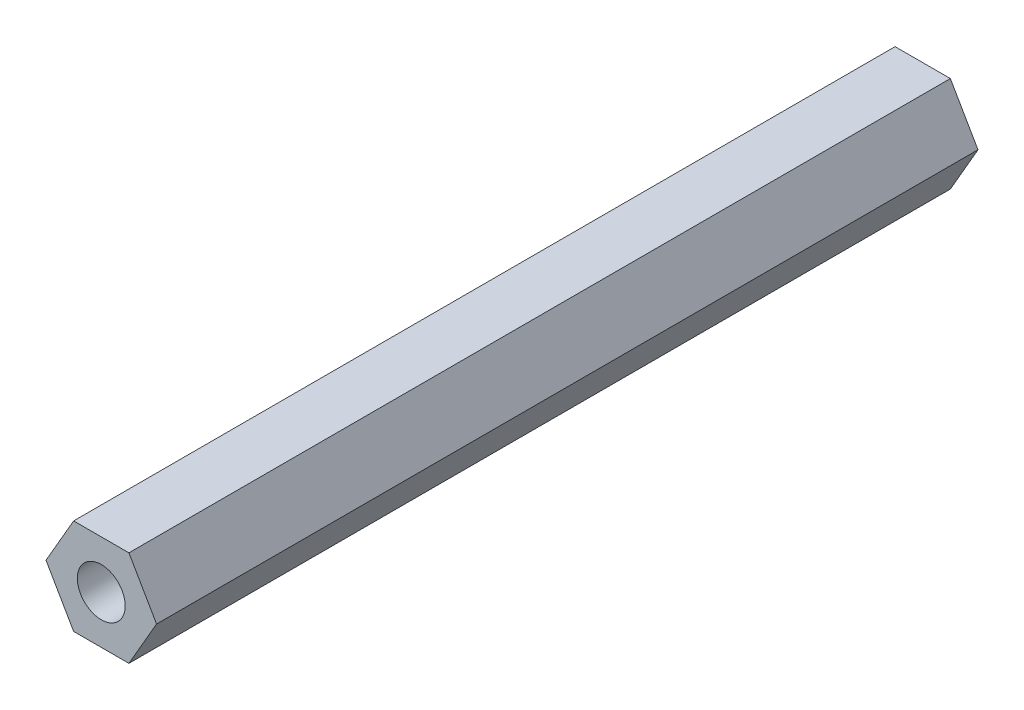
ISO-10303-21;
HEADER;
FILE_DESCRIPTION(('STEP AP214'),'2;1');
FILE_NAME('part.step','',(''),(''),'','','');
FILE_SCHEMA(('AUTOMOTIVE_DESIGN { 1 0 10303 214 1 1 1 1 }'));
ENDSEC;
DATA;
#1=APPLICATION_CONTEXT('core data for automotive mechanical design processes');
#2=APPLICATION_PROTOCOL_DEFINITION('international standard','automotive_design',2000,#1);
#3=PRODUCT_CONTEXT('',#1,'mechanical');
#4=PRODUCT('Part','Part','',(#3));
#5=PRODUCT_RELATED_PRODUCT_CATEGORY('part','',(#4));
#6=PRODUCT_DEFINITION_FORMATION('','',#4);
#7=PRODUCT_DEFINITION_CONTEXT('part definition',#1,'design');
#8=PRODUCT_DEFINITION('design','',#6,#7);
#9=PRODUCT_DEFINITION_SHAPE('','',#8);
#10=(LENGTH_UNIT() NAMED_UNIT(*) SI_UNIT(.MILLI.,.METRE.));
#11=(NAMED_UNIT(*) PLANE_ANGLE_UNIT() SI_UNIT($,.RADIAN.));
#12=(NAMED_UNIT(*) SI_UNIT($,.STERADIAN.) SOLID_ANGLE_UNIT());
#13=UNCERTAINTY_MEASURE_WITH_UNIT(LENGTH_MEASURE(1.E-05),#10,'distance_accuracy_value','');
#14=(GEOMETRIC_REPRESENTATION_CONTEXT(3) GLOBAL_UNCERTAINTY_ASSIGNED_CONTEXT((#13)) GLOBAL_UNIT_ASSIGNED_CONTEXT((#10,
#11,#12)) REPRESENTATION_CONTEXT('',''));
#15=CARTESIAN_POINT('',(0.,0.,0.));
#16=DIRECTION('',(0.,0.,1.));
#17=DIRECTION('',(1.,0.,0.));
#18=AXIS2_PLACEMENT_3D('',#15,#16,#17);
#19=CARTESIAN_POINT('',(0.,0.,54.483));
#20=DIRECTION('',(0.,0.,1.));
#21=DIRECTION('',(1.,0.,0.));
#22=AXIS2_PLACEMENT_3D('',#19,#20,#21);
#23=PLANE('',#22);
#24=DIRECTION('',(-0.5,0.866025403784439,0.));
#25=VECTOR('',#24,1.);
#26=CARTESIAN_POINT('',(7.33234841870825,0.,54.483));
#27=LINE('',#26,#25);
#28=CARTESIAN_POINT('',(7.33234841870825,0.,54.483));
#29=VERTEX_POINT('',#28);
#30=CARTESIAN_POINT('',(3.66617420935413,6.35,54.483));
#31=VERTEX_POINT('',#30);
#32=EDGE_CURVE('E146',#29,#31,#27,.T.);
#33=ORIENTED_EDGE('',*,*,#32,.T.);
#34=DIRECTION('',(-1.,0.,0.));
#35=VECTOR('',#34,1.);
#36=CARTESIAN_POINT('',(3.66617420935413,6.35,54.483));
#37=LINE('',#36,#35);
#38=CARTESIAN_POINT('',(-3.66617420935412,6.35,54.483));
#39=VERTEX_POINT('',#38);
#40=EDGE_CURVE('E99',#31,#39,#37,.T.);
#41=ORIENTED_EDGE('',*,*,#40,.T.);
#42=DIRECTION('',(-0.5,-0.866025403784438,0.));
#43=VECTOR('',#42,1.);
#44=CARTESIAN_POINT('',(-3.66617420935412,6.35,54.483));
#45=LINE('',#44,#43);
#46=CARTESIAN_POINT('',(-7.33234841870825,0.,54.483));
#47=VERTEX_POINT('',#46);
#48=EDGE_CURVE('E113',#39,#47,#45,.T.);
#49=ORIENTED_EDGE('',*,*,#48,.T.);
#50=DIRECTION('',(0.5,-0.866025403784439,0.));
#51=VECTOR('',#50,1.);
#52=CARTESIAN_POINT('',(-7.33234841870825,0.,54.483));
#53=LINE('',#52,#51);
#54=CARTESIAN_POINT('',(-3.66617420935413,-6.35,54.483));
#55=VERTEX_POINT('',#54);
#56=EDGE_CURVE('E107',#47,#55,#53,.T.);
#57=ORIENTED_EDGE('',*,*,#56,.T.);
#58=DIRECTION('',(1.,0.,0.));
#59=VECTOR('',#58,1.);
#60=CARTESIAN_POINT('',(-3.66617420935413,-6.35,54.483));
#61=LINE('',#60,#59);
#62=CARTESIAN_POINT('',(3.66617420935412,-6.35,54.483));
#63=VERTEX_POINT('',#62);
#64=EDGE_CURVE('E111',#55,#63,#61,.T.);
#65=ORIENTED_EDGE('',*,*,#64,.T.);
#66=DIRECTION('',(0.5,0.866025403784438,0.));
#67=VECTOR('',#66,1.);
#68=CARTESIAN_POINT('',(3.66617420935412,-6.35,54.483));
#69=LINE('',#68,#67);
#70=EDGE_CURVE('E60',#63,#29,#69,.T.);
#71=ORIENTED_EDGE('',*,*,#70,.T.);
#72=EDGE_LOOP('',(#33,#41,#49,#57,#65,#71));
#73=FACE_BOUND('',#72,.T.);
#74=CARTESIAN_POINT('',(0.,0.,54.483));
#75=DIRECTION('',(0.,0.,1.));
#76=DIRECTION('',(1.,0.,0.));
#77=AXIS2_PLACEMENT_3D('',#74,#75,#76);
#78=CIRCLE('',#77,3.175);
#79=CARTESIAN_POINT('',(3.175,0.,54.483));
#80=VERTEX_POINT('',#79);
#81=EDGE_CURVE('E139',#80,#80,#78,.T.);
#82=ORIENTED_EDGE('',*,*,#81,.F.);
#83=EDGE_LOOP('',(#82));
#84=FACE_BOUND('',#83,.T.);
#85=ADVANCED_FACE('F39',(#73,#84),#23,.T.);
#86=CARTESIAN_POINT('',(0.,0.,-54.483));
#87=DIRECTION('',(0.,0.,1.));
#88=DIRECTION('',(1.,0.,0.));
#89=AXIS2_PLACEMENT_3D('',#86,#87,#88);
#90=PLANE('',#89);
#91=DIRECTION('',(-0.5,0.866025403784439,0.));
#92=VECTOR('',#91,1.);
#93=CARTESIAN_POINT('',(7.33234841870825,0.,-54.483));
#94=LINE('',#93,#92);
#95=CARTESIAN_POINT('',(7.33234841870825,0.,-54.483));
#96=VERTEX_POINT('',#95);
#97=CARTESIAN_POINT('',(3.66617420935413,6.35,-54.483));
#98=VERTEX_POINT('',#97);
#99=EDGE_CURVE('E135',#96,#98,#94,.T.);
#100=ORIENTED_EDGE('',*,*,#99,.F.);
#101=DIRECTION('',(0.5,0.866025403784438,0.));
#102=VECTOR('',#101,1.);
#103=CARTESIAN_POINT('',(3.66617420935412,-6.35,-54.483));
#104=LINE('',#103,#102);
#105=CARTESIAN_POINT('',(3.66617420935412,-6.35,-54.483));
#106=VERTEX_POINT('',#105);
#107=EDGE_CURVE('E90',#106,#96,#104,.T.);
#108=ORIENTED_EDGE('',*,*,#107,.F.);
#109=DIRECTION('',(1.,0.,0.));
#110=VECTOR('',#109,1.);
#111=CARTESIAN_POINT('',(-3.66617420935413,-6.35,-54.483));
#112=LINE('',#111,#110);
#113=CARTESIAN_POINT('',(-3.66617420935413,-6.35,-54.483));
#114=VERTEX_POINT('',#113);
#115=EDGE_CURVE('E84',#114,#106,#112,.T.);
#116=ORIENTED_EDGE('',*,*,#115,.F.);
#117=DIRECTION('',(0.5,-0.866025403784439,0.));
#118=VECTOR('',#117,1.);
#119=CARTESIAN_POINT('',(-7.33234841870825,0.,-54.483));
#120=LINE('',#119,#118);
#121=CARTESIAN_POINT('',(-7.33234841870825,0.,-54.483));
#122=VERTEX_POINT('',#121);
#123=EDGE_CURVE('E122',#122,#114,#120,.T.);
#124=ORIENTED_EDGE('',*,*,#123,.F.);
#125=DIRECTION('',(-0.5,-0.866025403784438,0.));
#126=VECTOR('',#125,1.);
#127=CARTESIAN_POINT('',(-3.66617420935412,6.35,-54.483));
#128=LINE('',#127,#126);
#129=CARTESIAN_POINT('',(-3.66617420935412,6.35,-54.483));
#130=VERTEX_POINT('',#129);
#131=EDGE_CURVE('E141',#130,#122,#128,.T.);
#132=ORIENTED_EDGE('',*,*,#131,.F.);
#133=DIRECTION('',(-1.,0.,0.));
#134=VECTOR('',#133,1.);
#135=CARTESIAN_POINT('',(3.66617420935413,6.35,-54.483));
#136=LINE('',#135,#134);
#137=EDGE_CURVE('E138',#98,#130,#136,.T.);
#138=ORIENTED_EDGE('',*,*,#137,.F.);
#139=EDGE_LOOP('',(#100,#108,#116,#124,#132,#138));
#140=FACE_BOUND('',#139,.T.);
#141=CARTESIAN_POINT('',(0.,0.,-54.483));
#142=DIRECTION('',(0.,0.,1.));
#143=DIRECTION('',(1.,0.,0.));
#144=AXIS2_PLACEMENT_3D('',#141,#142,#143);
#145=CIRCLE('',#144,3.175);
#146=CARTESIAN_POINT('',(3.175,0.,-54.483));
#147=VERTEX_POINT('',#146);
#148=EDGE_CURVE('E249',#147,#147,#145,.T.);
#149=ORIENTED_EDGE('',*,*,#148,.T.);
#150=EDGE_LOOP('',(#149));
#151=FACE_BOUND('',#150,.T.);
#152=ADVANCED_FACE('F159',(#140,#151),#90,.F.);
#153=CARTESIAN_POINT('',(7.33234841870825,0.,54.483));
#154=DIRECTION('',(-0.866025403784439,-0.5,0.));
#155=DIRECTION('',(0.5,-0.866025403784439,0.));
#156=AXIS2_PLACEMENT_3D('',#153,#154,#155);
#157=PLANE('',#156);
#158=ORIENTED_EDGE('',*,*,#99,.T.);
#159=DIRECTION('',(0.,0.,-1.));
#160=VECTOR('',#159,1.);
#161=CARTESIAN_POINT('',(3.66617420935413,6.35,54.483));
#162=LINE('',#161,#160);
#163=EDGE_CURVE('E11',#31,#98,#162,.T.);
#164=ORIENTED_EDGE('',*,*,#163,.F.);
#165=ORIENTED_EDGE('',*,*,#32,.F.);
#166=DIRECTION('',(0.,0.,-1.));
#167=VECTOR('',#166,1.);
#168=CARTESIAN_POINT('',(7.33234841870825,0.,54.483));
#169=LINE('',#168,#167);
#170=EDGE_CURVE('E131',#29,#96,#169,.T.);
#171=ORIENTED_EDGE('',*,*,#170,.T.);
#172=EDGE_LOOP('',(#158,#164,#165,#171));
#173=FACE_BOUND('',#172,.T.);
#174=ADVANCED_FACE('F41',(#173),#157,.F.);
#175=CARTESIAN_POINT('',(3.66617420935413,6.35,54.483));
#176=DIRECTION('',(0.,-1.,0.));
#177=DIRECTION('',(1.,0.,0.));
#178=AXIS2_PLACEMENT_3D('',#175,#176,#177);
#179=PLANE('',#178);
#180=ORIENTED_EDGE('',*,*,#137,.T.);
#181=DIRECTION('',(0.,0.,-1.));
#182=VECTOR('',#181,1.);
#183=CARTESIAN_POINT('',(-3.66617420935412,6.35,54.483));
#184=LINE('',#183,#182);
#185=EDGE_CURVE('E49',#39,#130,#184,.T.);
#186=ORIENTED_EDGE('',*,*,#185,.F.);
#187=ORIENTED_EDGE('',*,*,#40,.F.);
#188=ORIENTED_EDGE('',*,*,#163,.T.);
#189=EDGE_LOOP('',(#180,#186,#187,#188));
#190=FACE_BOUND('',#189,.T.);
#191=ADVANCED_FACE('F184',(#190),#179,.F.);
#192=CARTESIAN_POINT('',(-3.66617420935412,6.35,54.483));
#193=DIRECTION('',(0.866025403784438,-0.5,0.));
#194=DIRECTION('',(0.5,0.866025403784439,0.));
#195=AXIS2_PLACEMENT_3D('',#192,#193,#194);
#196=PLANE('',#195);
#197=ORIENTED_EDGE('',*,*,#131,.T.);
#198=DIRECTION('',(0.,0.,-1.));
#199=VECTOR('',#198,1.);
#200=CARTESIAN_POINT('',(-7.33234841870825,0.,54.483));
#201=LINE('',#200,#199);
#202=EDGE_CURVE('E124',#47,#122,#201,.T.);
#203=ORIENTED_EDGE('',*,*,#202,.F.);
#204=ORIENTED_EDGE('',*,*,#48,.F.);
#205=ORIENTED_EDGE('',*,*,#185,.T.);
#206=EDGE_LOOP('',(#197,#203,#204,#205));
#207=FACE_BOUND('',#206,.T.);
#208=ADVANCED_FACE('F156',(#207),#196,.F.);
#209=CARTESIAN_POINT('',(-7.33234841870825,0.,54.483));
#210=DIRECTION('',(0.866025403784439,0.5,0.));
#211=DIRECTION('',(-0.5,0.866025403784439,0.));
#212=AXIS2_PLACEMENT_3D('',#209,#210,#211);
#213=PLANE('',#212);
#214=ORIENTED_EDGE('',*,*,#123,.T.);
#215=DIRECTION('',(0.,0.,-1.));
#216=VECTOR('',#215,1.);
#217=CARTESIAN_POINT('',(-3.66617420935413,-6.35,54.483));
#218=LINE('',#217,#216);
#219=EDGE_CURVE('E119',#55,#114,#218,.T.);
#220=ORIENTED_EDGE('',*,*,#219,.F.);
#221=ORIENTED_EDGE('',*,*,#56,.F.);
#222=ORIENTED_EDGE('',*,*,#202,.T.);
#223=EDGE_LOOP('',(#214,#220,#221,#222));
#224=FACE_BOUND('',#223,.T.);
#225=ADVANCED_FACE('F120',(#224),#213,.F.);
#226=CARTESIAN_POINT('',(-3.66617420935413,-6.35,54.483));
#227=DIRECTION('',(0.,1.,0.));
#228=DIRECTION('',(-1.,0.,0.));
#229=AXIS2_PLACEMENT_3D('',#226,#227,#228);
#230=PLANE('',#229);
#231=ORIENTED_EDGE('',*,*,#115,.T.);
#232=DIRECTION('',(0.,0.,-1.));
#233=VECTOR('',#232,1.);
#234=CARTESIAN_POINT('',(3.66617420935412,-6.35,54.483));
#235=LINE('',#234,#233);
#236=EDGE_CURVE('E125',#63,#106,#235,.T.);
#237=ORIENTED_EDGE('',*,*,#236,.F.);
#238=ORIENTED_EDGE('',*,*,#64,.F.);
#239=ORIENTED_EDGE('',*,*,#219,.T.);
#240=EDGE_LOOP('',(#231,#237,#238,#239));
#241=FACE_BOUND('',#240,.T.);
#242=ADVANCED_FACE('F127',(#241),#230,.F.);
#243=CARTESIAN_POINT('',(3.66617420935412,-6.35,54.483));
#244=DIRECTION('',(-0.866025403784438,0.5,0.));
#245=DIRECTION('',(-0.5,-0.866025403784438,0.));
#246=AXIS2_PLACEMENT_3D('',#243,#244,#245);
#247=PLANE('',#246);
#248=ORIENTED_EDGE('',*,*,#107,.T.);
#249=ORIENTED_EDGE('',*,*,#170,.F.);
#250=ORIENTED_EDGE('',*,*,#70,.F.);
#251=ORIENTED_EDGE('',*,*,#236,.T.);
#252=EDGE_LOOP('',(#248,#249,#250,#251));
#253=FACE_BOUND('',#252,.T.);
#254=ADVANCED_FACE('F164',(#253),#247,.F.);
#255=CARTESIAN_POINT('',(0.,0.,54.483));
#256=DIRECTION('',(0.,0.,-1.));
#257=DIRECTION('',(-1.,0.,0.));
#258=AXIS2_PLACEMENT_3D('',#255,#256,#257);
#259=CYLINDRICAL_SURFACE('',#258,3.175);
#260=ORIENTED_EDGE('',*,*,#81,.T.);
#261=EDGE_LOOP('',(#260));
#262=FACE_BOUND('',#261,.T.);
#263=ORIENTED_EDGE('',*,*,#148,.F.);
#264=EDGE_LOOP('',(#263));
#265=FACE_BOUND('',#264,.T.);
#266=ADVANCED_FACE('F166',(#262,#265),#259,.F.);
#267=CLOSED_SHELL('',(#85,#152,#174,#191,#208,#225,#242,#254,#266));
#268=MANIFOLD_SOLID_BREP('B2',#267);
#269=ADVANCED_BREP_SHAPE_REPRESENTATION('',(#18,#268),#14);
#270=SHAPE_DEFINITION_REPRESENTATION(#9,#269);
ENDSEC;
END-ISO-10303-21;
